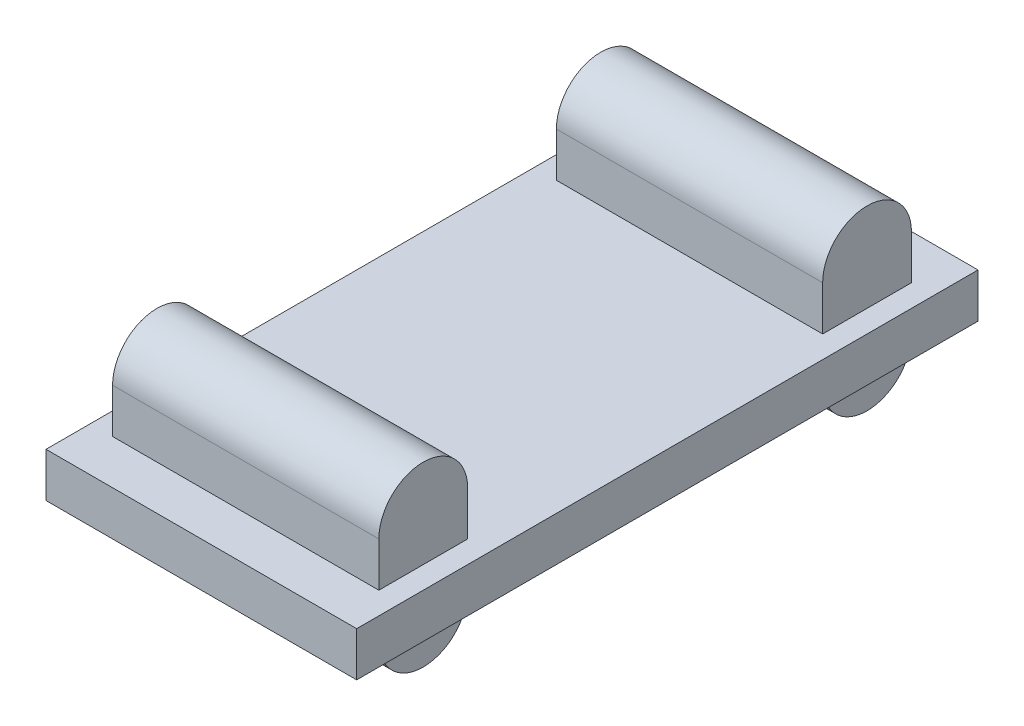
ISO-10303-21;
HEADER;
FILE_DESCRIPTION(('STEP AP214'),'2;1');
FILE_NAME('part.step','',(''),(''),'','','');
FILE_SCHEMA(('AUTOMOTIVE_DESIGN { 1 0 10303 214 1 1 1 1 }'));
ENDSEC;
DATA;
#1=APPLICATION_CONTEXT('core data for automotive mechanical design processes');
#2=APPLICATION_PROTOCOL_DEFINITION('international standard','automotive_design',2000,#1);
#3=PRODUCT_CONTEXT('',#1,'mechanical');
#4=PRODUCT('Part','Part','',(#3));
#5=PRODUCT_RELATED_PRODUCT_CATEGORY('part','',(#4));
#6=PRODUCT_DEFINITION_FORMATION('','',#4);
#7=PRODUCT_DEFINITION_CONTEXT('part definition',#1,'design');
#8=PRODUCT_DEFINITION('design','',#6,#7);
#9=PRODUCT_DEFINITION_SHAPE('','',#8);
#10=(LENGTH_UNIT() NAMED_UNIT(*) SI_UNIT(.MILLI.,.METRE.));
#11=(NAMED_UNIT(*) PLANE_ANGLE_UNIT() SI_UNIT($,.RADIAN.));
#12=(NAMED_UNIT(*) SI_UNIT($,.STERADIAN.) SOLID_ANGLE_UNIT());
#13=UNCERTAINTY_MEASURE_WITH_UNIT(LENGTH_MEASURE(1.E-05),#10,'distance_accuracy_value','');
#14=(GEOMETRIC_REPRESENTATION_CONTEXT(3) GLOBAL_UNCERTAINTY_ASSIGNED_CONTEXT((#13)) GLOBAL_UNIT_ASSIGNED_CONTEXT((#10,
#11,#12)) REPRESENTATION_CONTEXT('',''));
#15=CARTESIAN_POINT('',(0.,0.,0.));
#16=DIRECTION('',(0.,0.,1.));
#17=DIRECTION('',(1.,0.,0.));
#18=AXIS2_PLACEMENT_3D('',#15,#16,#17);
#19=CARTESIAN_POINT('',(-88.9,12.7,177.8));
#20=DIRECTION('',(1.,0.,0.));
#21=DIRECTION('',(0.,0.,-1.));
#22=AXIS2_PLACEMENT_3D('',#19,#20,#21);
#23=PLANE('',#22);
#24=DIRECTION('',(0.,0.,1.));
#25=VECTOR('',#24,1.);
#26=CARTESIAN_POINT('',(-88.9,-12.7,177.8));
#27=LINE('',#26,#25);
#28=CARTESIAN_POINT('',(-88.9,-12.7,-177.8));
#29=VERTEX_POINT('',#28);
#30=CARTESIAN_POINT('',(-88.9,-12.7,177.8));
#31=VERTEX_POINT('',#30);
#32=EDGE_CURVE('E235',#29,#31,#27,.T.);
#33=ORIENTED_EDGE('',*,*,#32,.T.);
#34=DIRECTION('',(0.,-1.,0.));
#35=VECTOR('',#34,1.);
#36=CARTESIAN_POINT('',(-88.9,12.7,177.8));
#37=LINE('',#36,#35);
#38=CARTESIAN_POINT('',(-88.9,12.7,177.8));
#39=VERTEX_POINT('',#38);
#40=EDGE_CURVE('E262',#39,#31,#37,.T.);
#41=ORIENTED_EDGE('',*,*,#40,.F.);
#42=DIRECTION('',(0.,0.,1.));
#43=VECTOR('',#42,1.);
#44=CARTESIAN_POINT('',(-88.9,12.7,177.8));
#45=LINE('',#44,#43);
#46=CARTESIAN_POINT('',(-88.9,12.7,-177.8));
#47=VERTEX_POINT('',#46);
#48=EDGE_CURVE('E236',#47,#39,#45,.T.);
#49=ORIENTED_EDGE('',*,*,#48,.F.);
#50=DIRECTION('',(0.,-1.,0.));
#51=VECTOR('',#50,1.);
#52=CARTESIAN_POINT('',(-88.9,12.7,-177.8));
#53=LINE('',#52,#51);
#54=EDGE_CURVE('E246',#47,#29,#53,.T.);
#55=ORIENTED_EDGE('',*,*,#54,.T.);
#56=EDGE_LOOP('',(#33,#41,#49,#55));
#57=FACE_BOUND('',#56,.T.);
#58=ADVANCED_FACE('F33',(#57),#23,.F.);
#59=CARTESIAN_POINT('',(88.9,12.7,177.8));
#60=DIRECTION('',(0.,0.,-1.));
#61=DIRECTION('',(-1.,0.,0.));
#62=AXIS2_PLACEMENT_3D('',#59,#60,#61);
#63=PLANE('',#62);
#64=DIRECTION('',(1.,0.,0.));
#65=VECTOR('',#64,1.);
#66=CARTESIAN_POINT('',(88.9,-12.7,177.8));
#67=LINE('',#66,#65);
#68=CARTESIAN_POINT('',(88.9,-12.7,177.8));
#69=VERTEX_POINT('',#68);
#70=EDGE_CURVE('E249',#31,#69,#67,.T.);
#71=ORIENTED_EDGE('',*,*,#70,.T.);
#72=DIRECTION('',(0.,-1.,0.));
#73=VECTOR('',#72,1.);
#74=CARTESIAN_POINT('',(88.9,12.7,177.8));
#75=LINE('',#74,#73);
#76=CARTESIAN_POINT('',(88.9,12.7,177.8));
#77=VERTEX_POINT('',#76);
#78=EDGE_CURVE('E259',#77,#69,#75,.T.);
#79=ORIENTED_EDGE('',*,*,#78,.F.);
#80=DIRECTION('',(1.,0.,0.));
#81=VECTOR('',#80,1.);
#82=CARTESIAN_POINT('',(88.9,12.7,177.8));
#83=LINE('',#82,#81);
#84=EDGE_CURVE('E239',#39,#77,#83,.T.);
#85=ORIENTED_EDGE('',*,*,#84,.F.);
#86=ORIENTED_EDGE('',*,*,#40,.T.);
#87=EDGE_LOOP('',(#71,#79,#85,#86));
#88=FACE_BOUND('',#87,.T.);
#89=ADVANCED_FACE('F297',(#88),#63,.F.);
#90=CARTESIAN_POINT('',(88.9,12.7,177.8));
#91=DIRECTION('',(-1.,0.,0.));
#92=DIRECTION('',(0.,0.,1.));
#93=AXIS2_PLACEMENT_3D('',#90,#91,#92);
#94=PLANE('',#93);
#95=DIRECTION('',(0.,0.,-1.));
#96=VECTOR('',#95,1.);
#97=CARTESIAN_POINT('',(88.9,-12.7,177.8));
#98=LINE('',#97,#96);
#99=CARTESIAN_POINT('',(88.8999999999999,-12.7,-177.8));
#100=VERTEX_POINT('',#99);
#101=EDGE_CURVE('E251',#69,#100,#98,.T.);
#102=ORIENTED_EDGE('',*,*,#101,.T.);
#103=DIRECTION('',(0.,-1.,0.));
#104=VECTOR('',#103,1.);
#105=CARTESIAN_POINT('',(88.8999999999999,12.7,-177.8));
#106=LINE('',#105,#104);
#107=CARTESIAN_POINT('',(88.8999999999999,12.7,-177.8));
#108=VERTEX_POINT('',#107);
#109=EDGE_CURVE('E256',#108,#100,#106,.T.);
#110=ORIENTED_EDGE('',*,*,#109,.F.);
#111=DIRECTION('',(0.,0.,-1.));
#112=VECTOR('',#111,1.);
#113=CARTESIAN_POINT('',(88.9,12.7,177.8));
#114=LINE('',#113,#112);
#115=EDGE_CURVE('E242',#77,#108,#114,.T.);
#116=ORIENTED_EDGE('',*,*,#115,.F.);
#117=ORIENTED_EDGE('',*,*,#78,.T.);
#118=EDGE_LOOP('',(#102,#110,#116,#117));
#119=FACE_BOUND('',#118,.T.);
#120=ADVANCED_FACE('F302',(#119),#94,.F.);
#121=CARTESIAN_POINT('',(88.8999999999999,12.7,-177.8));
#122=DIRECTION('',(0.,0.,1.));
#123=DIRECTION('',(1.,0.,0.));
#124=AXIS2_PLACEMENT_3D('',#121,#122,#123);
#125=PLANE('',#124);
#126=DIRECTION('',(-1.,0.,0.));
#127=VECTOR('',#126,1.);
#128=CARTESIAN_POINT('',(88.8999999999999,-12.7,-177.8));
#129=LINE('',#128,#127);
#130=EDGE_CURVE('E240',#100,#29,#129,.T.);
#131=ORIENTED_EDGE('',*,*,#130,.T.);
#132=ORIENTED_EDGE('',*,*,#54,.F.);
#133=DIRECTION('',(-1.,0.,0.));
#134=VECTOR('',#133,1.);
#135=CARTESIAN_POINT('',(88.8999999999999,12.7,-177.8));
#136=LINE('',#135,#134);
#137=EDGE_CURVE('E244',#108,#47,#136,.T.);
#138=ORIENTED_EDGE('',*,*,#137,.F.);
#139=ORIENTED_EDGE('',*,*,#109,.T.);
#140=EDGE_LOOP('',(#131,#132,#138,#139));
#141=FACE_BOUND('',#140,.T.);
#142=ADVANCED_FACE('F318',(#141),#125,.F.);
#143=CARTESIAN_POINT('',(0.,12.7,0.));
#144=DIRECTION('',(0.,1.,0.));
#145=DIRECTION('',(0.,0.,1.));
#146=AXIS2_PLACEMENT_3D('',#143,#144,#145);
#147=PLANE('',#146);
#148=DIRECTION('',(0.,0.,-1.));
#149=VECTOR('',#148,1.);
#150=CARTESIAN_POINT('',(76.2,12.7,0.));
#151=LINE('',#150,#149);
#152=CARTESIAN_POINT('',(76.2,12.7,-101.6));
#153=VERTEX_POINT('',#152);
#154=CARTESIAN_POINT('',(76.2,12.7,-152.4));
#155=VERTEX_POINT('',#154);
#156=EDGE_CURVE('E150',#153,#155,#151,.T.);
#157=ORIENTED_EDGE('',*,*,#156,.F.);
#158=DIRECTION('',(-1.,0.,0.));
#159=VECTOR('',#158,1.);
#160=CARTESIAN_POINT('',(0.,12.7,-101.6));
#161=LINE('',#160,#159);
#162=CARTESIAN_POINT('',(-76.2,12.7,-101.6));
#163=VERTEX_POINT('',#162);
#164=EDGE_CURVE('E188',#153,#163,#161,.T.);
#165=ORIENTED_EDGE('',*,*,#164,.T.);
#166=DIRECTION('',(0.,0.,-1.));
#167=VECTOR('',#166,1.);
#168=CARTESIAN_POINT('',(-76.2,12.7,0.));
#169=LINE('',#168,#167);
#170=CARTESIAN_POINT('',(-76.2,12.7,-152.4));
#171=VERTEX_POINT('',#170);
#172=EDGE_CURVE('E184',#163,#171,#169,.T.);
#173=ORIENTED_EDGE('',*,*,#172,.T.);
#174=DIRECTION('',(1.,0.,0.));
#175=VECTOR('',#174,1.);
#176=CARTESIAN_POINT('',(0.,12.7,-152.4));
#177=LINE('',#176,#175);
#178=EDGE_CURVE('E191',#171,#155,#177,.T.);
#179=ORIENTED_EDGE('',*,*,#178,.T.);
#180=EDGE_LOOP('',(#157,#165,#173,#179));
#181=FACE_BOUND('',#180,.T.);
#182=DIRECTION('',(0.,0.,-1.));
#183=VECTOR('',#182,1.);
#184=CARTESIAN_POINT('',(76.2,12.7,0.));
#185=LINE('',#184,#183);
#186=CARTESIAN_POINT('',(76.2,12.7,152.4));
#187=VERTEX_POINT('',#186);
#188=CARTESIAN_POINT('',(76.2,12.7,101.6));
#189=VERTEX_POINT('',#188);
#190=EDGE_CURVE('E227',#187,#189,#185,.T.);
#191=ORIENTED_EDGE('',*,*,#190,.F.);
#192=DIRECTION('',(-1.,0.,0.));
#193=VECTOR('',#192,1.);
#194=CARTESIAN_POINT('',(0.,12.7,152.4));
#195=LINE('',#194,#193);
#196=CARTESIAN_POINT('',(-76.2,12.7,152.4));
#197=VERTEX_POINT('',#196);
#198=EDGE_CURVE('E229',#187,#197,#195,.T.);
#199=ORIENTED_EDGE('',*,*,#198,.T.);
#200=DIRECTION('',(0.,0.,-1.));
#201=VECTOR('',#200,1.);
#202=CARTESIAN_POINT('',(-76.2,12.7,0.));
#203=LINE('',#202,#201);
#204=CARTESIAN_POINT('',(-76.2,12.7,101.6));
#205=VERTEX_POINT('',#204);
#206=EDGE_CURVE('E224',#197,#205,#203,.T.);
#207=ORIENTED_EDGE('',*,*,#206,.T.);
#208=DIRECTION('',(1.,0.,0.));
#209=VECTOR('',#208,1.);
#210=CARTESIAN_POINT('',(0.,12.7,101.6));
#211=LINE('',#210,#209);
#212=EDGE_CURVE('E232',#205,#189,#211,.T.);
#213=ORIENTED_EDGE('',*,*,#212,.T.);
#214=EDGE_LOOP('',(#191,#199,#207,#213));
#215=FACE_BOUND('',#214,.T.);
#216=ORIENTED_EDGE('',*,*,#48,.T.);
#217=ORIENTED_EDGE('',*,*,#84,.T.);
#218=ORIENTED_EDGE('',*,*,#115,.T.);
#219=ORIENTED_EDGE('',*,*,#137,.T.);
#220=EDGE_LOOP('',(#216,#217,#218,#219));
#221=FACE_BOUND('',#220,.T.);
#222=ADVANCED_FACE('F314',(#181,#215,#221),#147,.T.);
#223=CARTESIAN_POINT('',(0.,-12.7,0.));
#224=DIRECTION('',(0.,1.,0.));
#225=DIRECTION('',(0.,0.,1.));
#226=AXIS2_PLACEMENT_3D('',#223,#224,#225);
#227=PLANE('',#226);
#228=DIRECTION('',(-1.,0.,0.));
#229=VECTOR('',#228,1.);
#230=CARTESIAN_POINT('',(76.2,-12.7,-101.6));
#231=LINE('',#230,#229);
#232=CARTESIAN_POINT('',(76.2,-12.7,-101.6));
#233=VERTEX_POINT('',#232);
#234=CARTESIAN_POINT('',(-76.2,-12.7,-101.6));
#235=VERTEX_POINT('',#234);
#236=EDGE_CURVE('E167',#233,#235,#231,.T.);
#237=ORIENTED_EDGE('',*,*,#236,.F.);
#238=DIRECTION('',(0.,0.,-1.));
#239=VECTOR('',#238,1.);
#240=CARTESIAN_POINT('',(76.2,-12.7,0.));
#241=LINE('',#240,#239);
#242=CARTESIAN_POINT('',(76.2,-12.7,-152.4));
#243=VERTEX_POINT('',#242);
#244=EDGE_CURVE('E11',#233,#243,#241,.T.);
#245=ORIENTED_EDGE('',*,*,#244,.T.);
#246=DIRECTION('',(-1.,0.,0.));
#247=VECTOR('',#246,1.);
#248=CARTESIAN_POINT('',(76.2,-12.7,-152.4));
#249=LINE('',#248,#247);
#250=CARTESIAN_POINT('',(-76.2,-12.7,-152.4));
#251=VERTEX_POINT('',#250);
#252=EDGE_CURVE('E159',#243,#251,#249,.T.);
#253=ORIENTED_EDGE('',*,*,#252,.T.);
#254=DIRECTION('',(0.,0.,-1.));
#255=VECTOR('',#254,1.);
#256=CARTESIAN_POINT('',(-76.2,-12.7,0.));
#257=LINE('',#256,#255);
#258=EDGE_CURVE('E40',#235,#251,#257,.T.);
#259=ORIENTED_EDGE('',*,*,#258,.F.);
#260=EDGE_LOOP('',(#237,#245,#253,#259));
#261=FACE_BOUND('',#260,.T.);
#262=DIRECTION('',(-1.,0.,0.));
#263=VECTOR('',#262,1.);
#264=CARTESIAN_POINT('',(76.2,-12.7,152.4));
#265=LINE('',#264,#263);
#266=CARTESIAN_POINT('',(76.2,-12.7,152.4));
#267=VERTEX_POINT('',#266);
#268=CARTESIAN_POINT('',(-76.2,-12.7,152.4));
#269=VERTEX_POINT('',#268);
#270=EDGE_CURVE('E205',#267,#269,#265,.T.);
#271=ORIENTED_EDGE('',*,*,#270,.F.);
#272=DIRECTION('',(0.,0.,-1.));
#273=VECTOR('',#272,1.);
#274=CARTESIAN_POINT('',(76.2,-12.7,0.));
#275=LINE('',#274,#273);
#276=CARTESIAN_POINT('',(76.2,-12.7,101.6));
#277=VERTEX_POINT('',#276);
#278=EDGE_CURVE('E268',#267,#277,#275,.T.);
#279=ORIENTED_EDGE('',*,*,#278,.T.);
#280=DIRECTION('',(-1.,0.,0.));
#281=VECTOR('',#280,1.);
#282=CARTESIAN_POINT('',(76.2,-12.7,101.6));
#283=LINE('',#282,#281);
#284=CARTESIAN_POINT('',(-76.2,-12.7,101.6));
#285=VERTEX_POINT('',#284);
#286=EDGE_CURVE('E222',#277,#285,#283,.T.);
#287=ORIENTED_EDGE('',*,*,#286,.T.);
#288=DIRECTION('',(0.,0.,-1.));
#289=VECTOR('',#288,1.);
#290=CARTESIAN_POINT('',(-76.2,-12.7,0.));
#291=LINE('',#290,#289);
#292=EDGE_CURVE('E265',#269,#285,#291,.T.);
#293=ORIENTED_EDGE('',*,*,#292,.F.);
#294=EDGE_LOOP('',(#271,#279,#287,#293));
#295=FACE_BOUND('',#294,.T.);
#296=ORIENTED_EDGE('',*,*,#32,.F.);
#297=ORIENTED_EDGE('',*,*,#130,.F.);
#298=ORIENTED_EDGE('',*,*,#101,.F.);
#299=ORIENTED_EDGE('',*,*,#70,.F.);
#300=EDGE_LOOP('',(#296,#297,#298,#299));
#301=FACE_BOUND('',#300,.T.);
#302=ADVANCED_FACE('F277',(#261,#295,#301),#227,.F.);
#303=CARTESIAN_POINT('',(76.2,-12.7,127.));
#304=DIRECTION('',(1.,0.,0.));
#305=DIRECTION('',(0.,0.,-1.));
#306=AXIS2_PLACEMENT_3D('',#303,#304,#305);
#307=PLANE('',#306);
#308=ORIENTED_EDGE('',*,*,#278,.F.);
#309=CARTESIAN_POINT('',(76.2,-12.7,127.));
#310=DIRECTION('',(1.,0.,0.));
#311=DIRECTION('',(0.,0.,-1.));
#312=AXIS2_PLACEMENT_3D('',#309,#310,#311);
#313=CIRCLE('',#312,25.4);
#314=EDGE_CURVE('E194',#267,#277,#313,.T.);
#315=ORIENTED_EDGE('',*,*,#314,.T.);
#316=EDGE_LOOP('',(#308,#315));
#317=FACE_BOUND('',#316,.T.);
#318=ADVANCED_FACE('F329',(#317),#307,.T.);
#319=CARTESIAN_POINT('',(-76.2,-12.7,127.));
#320=DIRECTION('',(1.,0.,0.));
#321=DIRECTION('',(0.,0.,-1.));
#322=AXIS2_PLACEMENT_3D('',#319,#320,#321);
#323=PLANE('',#322);
#324=CARTESIAN_POINT('',(-76.2,-12.7,127.));
#325=DIRECTION('',(1.,0.,0.));
#326=DIRECTION('',(0.,0.,-1.));
#327=AXIS2_PLACEMENT_3D('',#324,#325,#326);
#328=CIRCLE('',#327,25.4);
#329=EDGE_CURVE('E193',#269,#285,#328,.T.);
#330=ORIENTED_EDGE('',*,*,#329,.F.);
#331=ORIENTED_EDGE('',*,*,#292,.T.);
#332=EDGE_LOOP('',(#330,#331));
#333=FACE_BOUND('',#332,.T.);
#334=ADVANCED_FACE('F293',(#333),#323,.F.);
#335=CARTESIAN_POINT('',(76.2,-12.7,127.));
#336=DIRECTION('',(-1.,0.,0.));
#337=DIRECTION('',(0.,0.,1.));
#338=AXIS2_PLACEMENT_3D('',#335,#336,#337);
#339=CYLINDRICAL_SURFACE('',#338,25.4);
#340=ORIENTED_EDGE('',*,*,#329,.T.);
#341=ORIENTED_EDGE('',*,*,#286,.F.);
#342=ORIENTED_EDGE('',*,*,#314,.F.);
#343=ORIENTED_EDGE('',*,*,#270,.T.);
#344=EDGE_LOOP('',(#340,#341,#342,#343));
#345=FACE_BOUND('',#344,.T.);
#346=ADVANCED_FACE('F333',(#345),#339,.T.);
#347=CARTESIAN_POINT('',(76.2,-12.7,101.6));
#348=DIRECTION('',(0.,0.,1.));
#349=DIRECTION('',(1.,0.,0.));
#350=AXIS2_PLACEMENT_3D('',#347,#348,#349);
#351=PLANE('',#350);
#352=ORIENTED_EDGE('',*,*,#212,.F.);
#353=DIRECTION('',(0.,1.,0.));
#354=VECTOR('',#353,1.);
#355=CARTESIAN_POINT('',(-76.2,-12.7,101.6));
#356=LINE('',#355,#354);
#357=CARTESIAN_POINT('',(-76.2,38.1,101.6));
#358=VERTEX_POINT('',#357);
#359=EDGE_CURVE('E208',#205,#358,#356,.T.);
#360=ORIENTED_EDGE('',*,*,#359,.T.);
#361=DIRECTION('',(-1.,0.,0.));
#362=VECTOR('',#361,1.);
#363=CARTESIAN_POINT('',(76.2,38.1,101.6));
#364=LINE('',#363,#362);
#365=CARTESIAN_POINT('',(76.2,38.1,101.6));
#366=VERTEX_POINT('',#365);
#367=EDGE_CURVE('E219',#366,#358,#364,.T.);
#368=ORIENTED_EDGE('',*,*,#367,.F.);
#369=DIRECTION('',(0.,1.,0.));
#370=VECTOR('',#369,1.);
#371=CARTESIAN_POINT('',(76.2,-12.7,101.6));
#372=LINE('',#371,#370);
#373=EDGE_CURVE('E197',#189,#366,#372,.T.);
#374=ORIENTED_EDGE('',*,*,#373,.F.);
#375=EDGE_LOOP('',(#352,#360,#368,#374));
#376=FACE_BOUND('',#375,.T.);
#377=ADVANCED_FACE('F336',(#376),#351,.F.);
#378=CARTESIAN_POINT('',(76.2,38.1,127.));
#379=DIRECTION('',(-1.,0.,0.));
#380=DIRECTION('',(0.,0.,1.));
#381=AXIS2_PLACEMENT_3D('',#378,#379,#380);
#382=CYLINDRICAL_SURFACE('',#381,25.4);
#383=CARTESIAN_POINT('',(-76.2,38.1,127.));
#384=DIRECTION('',(1.,0.,0.));
#385=DIRECTION('',(0.,0.,-1.));
#386=AXIS2_PLACEMENT_3D('',#383,#384,#385);
#387=CIRCLE('',#386,25.4);
#388=CARTESIAN_POINT('',(-76.2,38.1,152.4));
#389=VERTEX_POINT('',#388);
#390=EDGE_CURVE('E210',#358,#389,#387,.T.);
#391=ORIENTED_EDGE('',*,*,#390,.T.);
#392=DIRECTION('',(-1.,0.,0.));
#393=VECTOR('',#392,1.);
#394=CARTESIAN_POINT('',(76.2,38.1,152.4));
#395=LINE('',#394,#393);
#396=CARTESIAN_POINT('',(76.2,38.1,152.4));
#397=VERTEX_POINT('',#396);
#398=EDGE_CURVE('E216',#397,#389,#395,.T.);
#399=ORIENTED_EDGE('',*,*,#398,.F.);
#400=CARTESIAN_POINT('',(76.2,38.1,127.));
#401=DIRECTION('',(1.,0.,0.));
#402=DIRECTION('',(0.,0.,-1.));
#403=AXIS2_PLACEMENT_3D('',#400,#401,#402);
#404=CIRCLE('',#403,25.4);
#405=EDGE_CURVE('E200',#366,#397,#404,.T.);
#406=ORIENTED_EDGE('',*,*,#405,.F.);
#407=ORIENTED_EDGE('',*,*,#367,.T.);
#408=EDGE_LOOP('',(#391,#399,#406,#407));
#409=FACE_BOUND('',#408,.T.);
#410=ADVANCED_FACE('F340',(#409),#382,.T.);
#411=CARTESIAN_POINT('',(76.2,-12.7,152.4));
#412=DIRECTION('',(0.,0.,-1.));
#413=DIRECTION('',(-1.,0.,0.));
#414=AXIS2_PLACEMENT_3D('',#411,#412,#413);
#415=PLANE('',#414);
#416=ORIENTED_EDGE('',*,*,#198,.F.);
#417=DIRECTION('',(0.,-1.,0.));
#418=VECTOR('',#417,1.);
#419=CARTESIAN_POINT('',(76.2,-12.7,152.4));
#420=LINE('',#419,#418);
#421=EDGE_CURVE('E202',#397,#187,#420,.T.);
#422=ORIENTED_EDGE('',*,*,#421,.F.);
#423=ORIENTED_EDGE('',*,*,#398,.T.);
#424=DIRECTION('',(0.,-1.,0.));
#425=VECTOR('',#424,1.);
#426=CARTESIAN_POINT('',(-76.2,-12.7,152.4));
#427=LINE('',#426,#425);
#428=EDGE_CURVE('E198',#389,#197,#427,.T.);
#429=ORIENTED_EDGE('',*,*,#428,.T.);
#430=EDGE_LOOP('',(#416,#422,#423,#429));
#431=FACE_BOUND('',#430,.T.);
#432=ADVANCED_FACE('F344',(#431),#415,.F.);
#433=ORIENTED_EDGE('',*,*,#421,.T.);
#434=ORIENTED_EDGE('',*,*,#190,.T.);
#435=ORIENTED_EDGE('',*,*,#373,.T.);
#436=ORIENTED_EDGE('',*,*,#405,.T.);
#437=EDGE_LOOP('',(#433,#434,#435,#436));
#438=FACE_BOUND('',#437,.T.);
#439=ADVANCED_FACE('F290',(#438),#307,.T.);
#440=ORIENTED_EDGE('',*,*,#206,.F.);
#441=ORIENTED_EDGE('',*,*,#428,.F.);
#442=ORIENTED_EDGE('',*,*,#390,.F.);
#443=ORIENTED_EDGE('',*,*,#359,.F.);
#444=EDGE_LOOP('',(#440,#441,#442,#443));
#445=FACE_BOUND('',#444,.T.);
#446=ADVANCED_FACE('F282',(#445),#323,.F.);
#447=CARTESIAN_POINT('',(76.2,-12.7,-127.));
#448=DIRECTION('',(1.,0.,0.));
#449=DIRECTION('',(0.,0.,-1.));
#450=AXIS2_PLACEMENT_3D('',#447,#448,#449);
#451=PLANE('',#450);
#452=ORIENTED_EDGE('',*,*,#244,.F.);
#453=CARTESIAN_POINT('',(76.2,-12.7,-127.));
#454=DIRECTION('',(1.,0.,0.));
#455=DIRECTION('',(0.,0.,-1.));
#456=AXIS2_PLACEMENT_3D('',#453,#454,#455);
#457=CIRCLE('',#456,25.4);
#458=EDGE_CURVE('E153',#233,#243,#457,.T.);
#459=ORIENTED_EDGE('',*,*,#458,.T.);
#460=EDGE_LOOP('',(#452,#459));
#461=FACE_BOUND('',#460,.T.);
#462=ADVANCED_FACE('F280',(#461),#451,.T.);
#463=CARTESIAN_POINT('',(-76.2,-12.7,-127.));
#464=DIRECTION('',(1.,0.,0.));
#465=DIRECTION('',(0.,0.,-1.));
#466=AXIS2_PLACEMENT_3D('',#463,#464,#465);
#467=PLANE('',#466);
#468=CARTESIAN_POINT('',(-76.2,-12.7,-127.));
#469=DIRECTION('',(1.,0.,0.));
#470=DIRECTION('',(0.,0.,-1.));
#471=AXIS2_PLACEMENT_3D('',#468,#469,#470);
#472=CIRCLE('',#471,25.4);
#473=EDGE_CURVE('E171',#235,#251,#472,.T.);
#474=ORIENTED_EDGE('',*,*,#473,.F.);
#475=ORIENTED_EDGE('',*,*,#258,.T.);
#476=EDGE_LOOP('',(#474,#475));
#477=FACE_BOUND('',#476,.T.);
#478=ADVANCED_FACE('F272',(#477),#467,.F.);
#479=CARTESIAN_POINT('',(76.2,-12.7,-127.));
#480=DIRECTION('',(-1.,0.,0.));
#481=DIRECTION('',(0.,0.,1.));
#482=AXIS2_PLACEMENT_3D('',#479,#480,#481);
#483=CYLINDRICAL_SURFACE('',#482,25.4);
#484=ORIENTED_EDGE('',*,*,#473,.T.);
#485=ORIENTED_EDGE('',*,*,#252,.F.);
#486=ORIENTED_EDGE('',*,*,#458,.F.);
#487=ORIENTED_EDGE('',*,*,#236,.T.);
#488=EDGE_LOOP('',(#484,#485,#486,#487));
#489=FACE_BOUND('',#488,.T.);
#490=ADVANCED_FACE('F275',(#489),#483,.T.);
#491=CARTESIAN_POINT('',(76.2,-12.7,-152.4));
#492=DIRECTION('',(0.,0.,1.));
#493=DIRECTION('',(1.,0.,0.));
#494=AXIS2_PLACEMENT_3D('',#491,#492,#493);
#495=PLANE('',#494);
#496=ORIENTED_EDGE('',*,*,#178,.F.);
#497=DIRECTION('',(0.,1.,0.));
#498=VECTOR('',#497,1.);
#499=CARTESIAN_POINT('',(-76.2,-12.7,-152.4));
#500=LINE('',#499,#498);
#501=CARTESIAN_POINT('',(-76.2,38.1,-152.4));
#502=VERTEX_POINT('',#501);
#503=EDGE_CURVE('E47',#171,#502,#500,.T.);
#504=ORIENTED_EDGE('',*,*,#503,.T.);
#505=DIRECTION('',(-1.,0.,0.));
#506=VECTOR('',#505,1.);
#507=CARTESIAN_POINT('',(76.2,38.1,-152.4));
#508=LINE('',#507,#506);
#509=CARTESIAN_POINT('',(76.2,38.1,-152.4));
#510=VERTEX_POINT('',#509);
#511=EDGE_CURVE('E156',#510,#502,#508,.T.);
#512=ORIENTED_EDGE('',*,*,#511,.F.);
#513=DIRECTION('',(0.,1.,0.));
#514=VECTOR('',#513,1.);
#515=CARTESIAN_POINT('',(76.2,-12.7,-152.4));
#516=LINE('',#515,#514);
#517=EDGE_CURVE('E142',#155,#510,#516,.T.);
#518=ORIENTED_EDGE('',*,*,#517,.F.);
#519=EDGE_LOOP('',(#496,#504,#512,#518));
#520=FACE_BOUND('',#519,.T.);
#521=ADVANCED_FACE('F157',(#520),#495,.F.);
#522=CARTESIAN_POINT('',(76.2,38.1,-127.));
#523=DIRECTION('',(-1.,0.,0.));
#524=DIRECTION('',(0.,0.,1.));
#525=AXIS2_PLACEMENT_3D('',#522,#523,#524);
#526=CYLINDRICAL_SURFACE('',#525,25.4);
#527=CARTESIAN_POINT('',(-76.2,38.1,-127.));
#528=DIRECTION('',(1.,0.,0.));
#529=DIRECTION('',(0.,0.,-1.));
#530=AXIS2_PLACEMENT_3D('',#527,#528,#529);
#531=CIRCLE('',#530,25.4);
#532=CARTESIAN_POINT('',(-76.2,38.1,-101.6));
#533=VERTEX_POINT('',#532);
#534=EDGE_CURVE('E175',#502,#533,#531,.T.);
#535=ORIENTED_EDGE('',*,*,#534,.T.);
#536=DIRECTION('',(-1.,0.,0.));
#537=VECTOR('',#536,1.);
#538=CARTESIAN_POINT('',(76.2,38.1,-101.6));
#539=LINE('',#538,#537);
#540=CARTESIAN_POINT('',(76.2,38.1,-101.6));
#541=VERTEX_POINT('',#540);
#542=EDGE_CURVE('E160',#541,#533,#539,.T.);
#543=ORIENTED_EDGE('',*,*,#542,.F.);
#544=CARTESIAN_POINT('',(76.2,38.1,-127.));
#545=DIRECTION('',(1.,0.,0.));
#546=DIRECTION('',(0.,0.,-1.));
#547=AXIS2_PLACEMENT_3D('',#544,#545,#546);
#548=CIRCLE('',#547,25.4);
#549=EDGE_CURVE('E147',#510,#541,#548,.T.);
#550=ORIENTED_EDGE('',*,*,#549,.F.);
#551=ORIENTED_EDGE('',*,*,#511,.T.);
#552=EDGE_LOOP('',(#535,#543,#550,#551));
#553=FACE_BOUND('',#552,.T.);
#554=ADVANCED_FACE('F162',(#553),#526,.T.);
#555=CARTESIAN_POINT('',(76.2,-12.7,-101.6));
#556=DIRECTION('',(0.,0.,-1.));
#557=DIRECTION('',(-1.,0.,0.));
#558=AXIS2_PLACEMENT_3D('',#555,#556,#557);
#559=PLANE('',#558);
#560=ORIENTED_EDGE('',*,*,#164,.F.);
#561=DIRECTION('',(0.,-1.,0.));
#562=VECTOR('',#561,1.);
#563=CARTESIAN_POINT('',(76.2,-12.7,-101.6));
#564=LINE('',#563,#562);
#565=EDGE_CURVE('E165',#541,#153,#564,.T.);
#566=ORIENTED_EDGE('',*,*,#565,.F.);
#567=ORIENTED_EDGE('',*,*,#542,.T.);
#568=DIRECTION('',(0.,-1.,0.));
#569=VECTOR('',#568,1.);
#570=CARTESIAN_POINT('',(-76.2,-12.7,-101.6));
#571=LINE('',#570,#569);
#572=EDGE_CURVE('E177',#533,#163,#571,.T.);
#573=ORIENTED_EDGE('',*,*,#572,.T.);
#574=EDGE_LOOP('',(#560,#566,#567,#573));
#575=FACE_BOUND('',#574,.T.);
#576=ADVANCED_FACE('F295',(#575),#559,.F.);
#577=ORIENTED_EDGE('',*,*,#565,.T.);
#578=ORIENTED_EDGE('',*,*,#156,.T.);
#579=ORIENTED_EDGE('',*,*,#517,.T.);
#580=ORIENTED_EDGE('',*,*,#549,.T.);
#581=EDGE_LOOP('',(#577,#578,#579,#580));
#582=FACE_BOUND('',#581,.T.);
#583=ADVANCED_FACE('F145',(#582),#451,.T.);
#584=ORIENTED_EDGE('',*,*,#172,.F.);
#585=ORIENTED_EDGE('',*,*,#572,.F.);
#586=ORIENTED_EDGE('',*,*,#534,.F.);
#587=ORIENTED_EDGE('',*,*,#503,.F.);
#588=EDGE_LOOP('',(#584,#585,#586,#587));
#589=FACE_BOUND('',#588,.T.);
#590=ADVANCED_FACE('F289',(#589),#467,.F.);
#591=CLOSED_SHELL('',(#58,#89,#120,#142,#222,#302,#318,#334,#346,#377,#410,#432,#439,#446,#462,
#478,#490,#521,#554,#576,#583,#590));
#592=MANIFOLD_SOLID_BREP('B2',#591);
#593=ADVANCED_BREP_SHAPE_REPRESENTATION('',(#18,#592),#14);
#594=SHAPE_DEFINITION_REPRESENTATION(#9,#593);
ENDSEC;
END-ISO-10303-21;
